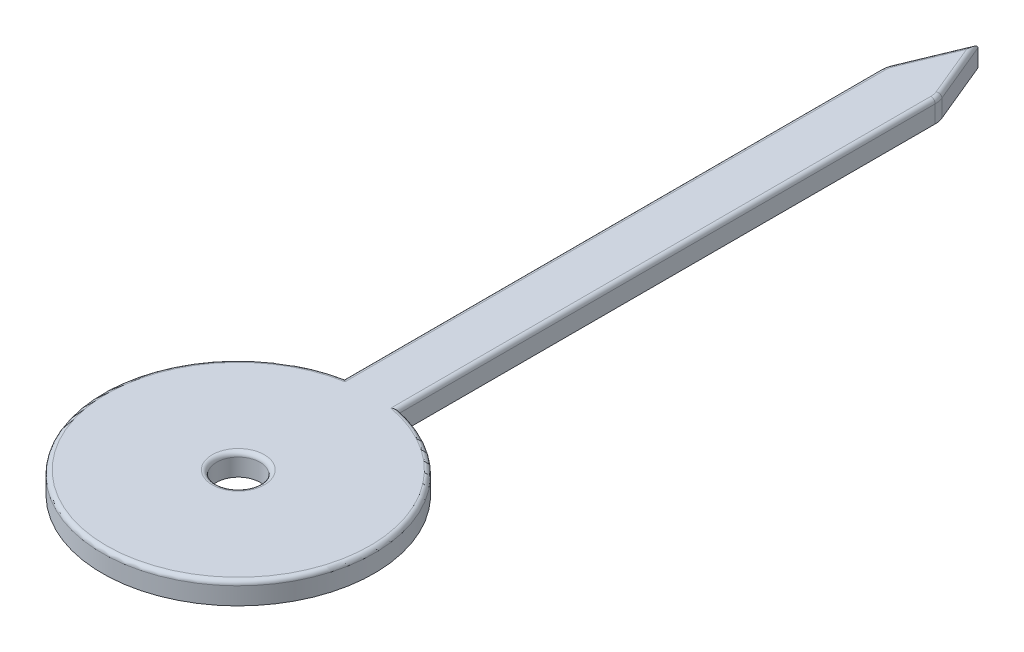
ISO-10303-21;
HEADER;
FILE_DESCRIPTION(('STEP AP214'),'2;1');
FILE_NAME('part.step','',(''),(''),'','','');
FILE_SCHEMA(('AUTOMOTIVE_DESIGN { 1 0 10303 214 1 1 1 1 }'));
ENDSEC;
DATA;
#1=APPLICATION_CONTEXT('core data for automotive mechanical design processes');
#2=APPLICATION_PROTOCOL_DEFINITION('international standard','automotive_design',2000,#1);
#3=PRODUCT_CONTEXT('',#1,'mechanical');
#4=PRODUCT('Part','Part','',(#3));
#5=PRODUCT_RELATED_PRODUCT_CATEGORY('part','',(#4));
#6=PRODUCT_DEFINITION_FORMATION('','',#4);
#7=PRODUCT_DEFINITION_CONTEXT('part definition',#1,'design');
#8=PRODUCT_DEFINITION('design','',#6,#7);
#9=PRODUCT_DEFINITION_SHAPE('','',#8);
#10=(LENGTH_UNIT() NAMED_UNIT(*) SI_UNIT(.MILLI.,.METRE.));
#11=(NAMED_UNIT(*) PLANE_ANGLE_UNIT() SI_UNIT($,.RADIAN.));
#12=(NAMED_UNIT(*) SI_UNIT($,.STERADIAN.) SOLID_ANGLE_UNIT());
#13=UNCERTAINTY_MEASURE_WITH_UNIT(LENGTH_MEASURE(1.E-05),#10,'distance_accuracy_value','');
#14=(GEOMETRIC_REPRESENTATION_CONTEXT(3) GLOBAL_UNCERTAINTY_ASSIGNED_CONTEXT((#13)) GLOBAL_UNIT_ASSIGNED_CONTEXT((#10,
#11,#12)) REPRESENTATION_CONTEXT('',''));
#15=CARTESIAN_POINT('',(0.,0.,0.));
#16=DIRECTION('',(0.,0.,1.));
#17=DIRECTION('',(1.,0.,0.));
#18=AXIS2_PLACEMENT_3D('',#15,#16,#17);
#19=CARTESIAN_POINT('',(0.,0.1,0.));
#20=DIRECTION('',(0.,1.,0.));
#21=DIRECTION('',(0.,0.,1.));
#22=AXIS2_PLACEMENT_3D('',#19,#20,#21);
#23=PLANE('',#22);
#24=CARTESIAN_POINT('',(0.,0.1,0.));
#25=DIRECTION('',(0.,1.,0.));
#26=DIRECTION('',(0.,0.,1.));
#27=AXIS2_PLACEMENT_3D('',#24,#25,#26);
#28=CIRCLE('',#27,0.12);
#29=CARTESIAN_POINT('',(0.,0.1,0.12));
#30=VERTEX_POINT('',#29);
#31=EDGE_CURVE('E188',#30,#30,#28,.F.);
#32=ORIENTED_EDGE('',*,*,#31,.T.);
#33=EDGE_LOOP('',(#32));
#34=FACE_BOUND('',#33,.T.);
#35=CARTESIAN_POINT('',(0.0250000000000001,0.1,-3.0783320679654));
#36=DIRECTION('',(0.,1.,0.));
#37=DIRECTION('',(0.,0.,1.));
#38=AXIS2_PLACEMENT_3D('',#35,#36,#37);
#39=CIRCLE('',#38,0.08);
#40=CARTESIAN_POINT('',(0.105,0.1,-3.0783320679654));
#41=VERTEX_POINT('',#40);
#42=CARTESIAN_POINT('',(0.098910362600903,0.1,-3.1089467425546));
#43=VERTEX_POINT('',#42);
#44=EDGE_CURVE('E183',#41,#43,#39,.T.);
#45=ORIENTED_EDGE('',*,*,#44,.T.);
#46=DIRECTION('',(-0.382683432365091,0.,-0.923879532511286));
#47=VECTOR('',#46,1.);
#48=CARTESIAN_POINT('',(-0.0184775906502258,0.1,-3.3923463313527));
#49=LINE('',#48,#47);
#50=CARTESIAN_POINT('',(0.,0.1,-3.34773748140494));
#51=VERTEX_POINT('',#50);
#52=EDGE_CURVE('E185',#43,#51,#49,.T.);
#53=ORIENTED_EDGE('',*,*,#52,.T.);
#54=DIRECTION('',(-0.382683432365091,0.,0.923879532511286));
#55=VECTOR('',#54,1.);
#56=CARTESIAN_POINT('',(-0.0989103626009029,0.1,-3.10894674255461));
#57=LINE('',#56,#55);
#58=CARTESIAN_POINT('',(-0.0989103626009029,0.1,-3.10894674255461));
#59=VERTEX_POINT('',#58);
#60=EDGE_CURVE('E173',#51,#59,#57,.T.);
#61=ORIENTED_EDGE('',*,*,#60,.T.);
#62=CARTESIAN_POINT('',(-0.0250000000000001,0.1,-3.0783320679654));
#63=DIRECTION('',(0.,1.,0.));
#64=DIRECTION('',(0.,0.,1.));
#65=AXIS2_PLACEMENT_3D('',#62,#63,#64);
#66=CIRCLE('',#65,0.08);
#67=CARTESIAN_POINT('',(-0.105,0.1,-3.0783320679654));
#68=VERTEX_POINT('',#67);
#69=EDGE_CURVE('E175',#59,#68,#66,.T.);
#70=ORIENTED_EDGE('',*,*,#69,.T.);
#71=DIRECTION('',(0.,0.,1.));
#72=VECTOR('',#71,1.);
#73=CARTESIAN_POINT('',(-0.105,0.1,-0.612372435695795));
#74=LINE('',#73,#72);
#75=CARTESIAN_POINT('',(-0.105,0.1,-0.59581876439065));
#76=VERTEX_POINT('',#75);
#77=EDGE_CURVE('E177',#68,#76,#74,.T.);
#78=ORIENTED_EDGE('',*,*,#77,.T.);
#79=CARTESIAN_POINT('',(0.,0.1,0.));
#80=DIRECTION('',(0.,1.,0.));
#81=DIRECTION('',(0.,0.,1.));
#82=AXIS2_PLACEMENT_3D('',#79,#80,#81);
#83=CIRCLE('',#82,0.605000000000001);
#84=CARTESIAN_POINT('',(0.105,0.1,-0.59581876439065));
#85=VERTEX_POINT('',#84);
#86=EDGE_CURVE('E179',#76,#85,#83,.T.);
#87=ORIENTED_EDGE('',*,*,#86,.T.);
#88=DIRECTION('',(0.,0.,-1.));
#89=VECTOR('',#88,1.);
#90=CARTESIAN_POINT('',(0.105,0.1,-3.0783320679654));
#91=LINE('',#90,#89);
#92=EDGE_CURVE('E181',#85,#41,#91,.T.);
#93=ORIENTED_EDGE('',*,*,#92,.T.);
#94=EDGE_LOOP('',(#45,#53,#61,#70,#78,#87,#93));
#95=FACE_BOUND('',#94,.T.);
#96=ADVANCED_FACE('F33',(#34,#95),#23,.T.);
#97=CARTESIAN_POINT('',(0.,0.,0.));
#98=DIRECTION('',(0.,1.,0.));
#99=DIRECTION('',(0.,0.,1.));
#100=AXIS2_PLACEMENT_3D('',#97,#98,#99);
#101=PLANE('',#100);
#102=DIRECTION('',(0.,0.,1.));
#103=VECTOR('',#102,1.);
#104=CARTESIAN_POINT('',(-0.125,0.,-0.612372435695795));
#105=LINE('',#104,#103);
#106=CARTESIAN_POINT('',(-0.125,0.,-3.0783320679654));
#107=VERTEX_POINT('',#106);
#108=CARTESIAN_POINT('',(-0.125,0.,-0.612372435695795));
#109=VERTEX_POINT('',#108);
#110=EDGE_CURVE('E145',#107,#109,#105,.T.);
#111=ORIENTED_EDGE('',*,*,#110,.F.);
#112=CARTESIAN_POINT('',(-0.0250000000000001,0.,-3.0783320679654));
#113=DIRECTION('',(0.,1.,0.));
#114=DIRECTION('',(0.,0.,1.));
#115=AXIS2_PLACEMENT_3D('',#112,#113,#114);
#116=CIRCLE('',#115,0.1);
#117=CARTESIAN_POINT('',(-0.117387953251129,0.,-3.11660041120191));
#118=VERTEX_POINT('',#117);
#119=EDGE_CURVE('E144',#107,#118,#116,.F.);
#120=ORIENTED_EDGE('',*,*,#119,.T.);
#121=DIRECTION('',(-0.382683432365091,0.,0.923879532511286));
#122=VECTOR('',#121,1.);
#123=CARTESIAN_POINT('',(-0.125,0.,-3.09822330470336));
#124=LINE('',#123,#122);
#125=CARTESIAN_POINT('',(0.,0.,-3.4));
#126=VERTEX_POINT('',#125);
#127=EDGE_CURVE('E123',#126,#118,#124,.T.);
#128=ORIENTED_EDGE('',*,*,#127,.F.);
#129=DIRECTION('',(-0.382683432365091,0.,-0.923879532511286));
#130=VECTOR('',#129,1.);
#131=CARTESIAN_POINT('',(0.125,0.,-3.09822330470336));
#132=LINE('',#131,#130);
#133=CARTESIAN_POINT('',(0.117387953251129,0.,-3.11660041120191));
#134=VERTEX_POINT('',#133);
#135=EDGE_CURVE('E132',#134,#126,#132,.T.);
#136=ORIENTED_EDGE('',*,*,#135,.F.);
#137=CARTESIAN_POINT('',(0.0250000000000001,0.,-3.0783320679654));
#138=DIRECTION('',(0.,1.,0.));
#139=DIRECTION('',(0.,0.,1.));
#140=AXIS2_PLACEMENT_3D('',#137,#138,#139);
#141=CIRCLE('',#140,0.1);
#142=CARTESIAN_POINT('',(0.125,0.,-3.0783320679654));
#143=VERTEX_POINT('',#142);
#144=EDGE_CURVE('E161',#134,#143,#141,.F.);
#145=ORIENTED_EDGE('',*,*,#144,.T.);
#146=DIRECTION('',(0.,0.,-1.));
#147=VECTOR('',#146,1.);
#148=CARTESIAN_POINT('',(0.125,0.,-0.612372435695795));
#149=LINE('',#148,#147);
#150=CARTESIAN_POINT('',(0.125,0.,-0.612372435695795));
#151=VERTEX_POINT('',#150);
#152=EDGE_CURVE('E154',#151,#143,#149,.T.);
#153=ORIENTED_EDGE('',*,*,#152,.F.);
#154=CARTESIAN_POINT('',(0.,0.,0.));
#155=DIRECTION('',(0.,1.,0.));
#156=DIRECTION('',(0.,0.,1.));
#157=AXIS2_PLACEMENT_3D('',#154,#155,#156);
#158=CIRCLE('',#157,0.625000000000001);
#159=EDGE_CURVE('E148',#109,#151,#158,.T.);
#160=ORIENTED_EDGE('',*,*,#159,.F.);
#161=EDGE_LOOP('',(#111,#120,#128,#136,#145,#153,#160));
#162=FACE_BOUND('',#161,.T.);
#163=CARTESIAN_POINT('',(0.,0.,0.));
#164=DIRECTION('',(0.,1.,0.));
#165=DIRECTION('',(0.,0.,1.));
#166=AXIS2_PLACEMENT_3D('',#163,#164,#165);
#167=CIRCLE('',#166,0.1);
#168=CARTESIAN_POINT('',(0.,0.,0.1));
#169=VERTEX_POINT('',#168);
#170=EDGE_CURVE('E138',#169,#169,#167,.T.);
#171=ORIENTED_EDGE('',*,*,#170,.T.);
#172=EDGE_LOOP('',(#171));
#173=FACE_BOUND('',#172,.T.);
#174=ADVANCED_FACE('F141',(#162,#173),#101,.F.);
#175=CARTESIAN_POINT('',(0.125,0.1,-3.09822330470336));
#176=DIRECTION('',(-0.923879532511286,0.,0.382683432365091));
#177=DIRECTION('',(0.382683432365091,0.,0.923879532511286));
#178=AXIS2_PLACEMENT_3D('',#175,#176,#177);
#179=PLANE('',#178);
#180=DIRECTION('',(0.,-1.,0.));
#181=VECTOR('',#180,1.);
#182=CARTESIAN_POINT('',(0.,0.1,-3.4));
#183=LINE('',#182,#181);
#184=CARTESIAN_POINT('',(0.,0.08,-3.4));
#185=VERTEX_POINT('',#184);
#186=EDGE_CURVE('E119',#185,#126,#183,.T.);
#187=ORIENTED_EDGE('',*,*,#186,.F.);
#188=DIRECTION('',(-0.382683432365091,0.,-0.923879532511286));
#189=VECTOR('',#188,1.);
#190=CARTESIAN_POINT('',(0.117387953251129,0.08,-3.11660041120191));
#191=LINE('',#190,#189);
#192=CARTESIAN_POINT('',(0.117387953251129,0.08,-3.11660041120191));
#193=VERTEX_POINT('',#192);
#194=EDGE_CURVE('E191',#185,#193,#191,.F.);
#195=ORIENTED_EDGE('',*,*,#194,.T.);
#196=DIRECTION('',(0.,-1.,0.));
#197=VECTOR('',#196,1.);
#198=CARTESIAN_POINT('',(0.117387953251129,0.1,-3.11660041120191));
#199=LINE('',#198,#197);
#200=EDGE_CURVE('E135',#193,#134,#199,.T.);
#201=ORIENTED_EDGE('',*,*,#200,.T.);
#202=ORIENTED_EDGE('',*,*,#135,.T.);
#203=EDGE_LOOP('',(#187,#195,#201,#202));
#204=FACE_BOUND('',#203,.T.);
#205=ADVANCED_FACE('F133',(#204),#179,.F.);
#206=CARTESIAN_POINT('',(-0.125,0.1,-3.09822330470336));
#207=DIRECTION('',(0.923879532511286,0.,0.382683432365091));
#208=DIRECTION('',(0.382683432365091,0.,-0.923879532511286));
#209=AXIS2_PLACEMENT_3D('',#206,#207,#208);
#210=PLANE('',#209);
#211=DIRECTION('',(0.,-1.,0.));
#212=VECTOR('',#211,1.);
#213=CARTESIAN_POINT('',(-0.117387953251129,0.1,-3.11660041120191));
#214=LINE('',#213,#212);
#215=CARTESIAN_POINT('',(-0.117387953251129,0.08,-3.11660041120191));
#216=VERTEX_POINT('',#215);
#217=EDGE_CURVE('E164',#118,#216,#214,.F.);
#218=ORIENTED_EDGE('',*,*,#217,.T.);
#219=DIRECTION('',(-0.382683432365091,0.,0.923879532511286));
#220=VECTOR('',#219,1.);
#221=CARTESIAN_POINT('',(0.,0.08,-3.4));
#222=LINE('',#221,#220);
#223=EDGE_CURVE('E11',#216,#185,#222,.F.);
#224=ORIENTED_EDGE('',*,*,#223,.T.);
#225=ORIENTED_EDGE('',*,*,#186,.T.);
#226=ORIENTED_EDGE('',*,*,#127,.T.);
#227=EDGE_LOOP('',(#218,#224,#225,#226));
#228=FACE_BOUND('',#227,.T.);
#229=ADVANCED_FACE('F121',(#228),#210,.F.);
#230=CARTESIAN_POINT('',(-0.125,0.1,-0.612372435695795));
#231=DIRECTION('',(1.,0.,0.));
#232=DIRECTION('',(0.,0.,-1.));
#233=AXIS2_PLACEMENT_3D('',#230,#231,#232);
#234=PLANE('',#233);
#235=DIRECTION('',(0.,-1.,0.));
#236=VECTOR('',#235,1.);
#237=CARTESIAN_POINT('',(-0.125,0.1,-0.612372435695795));
#238=LINE('',#237,#236);
#239=CARTESIAN_POINT('',(-0.125,0.08,-0.612372435695795));
#240=VERTEX_POINT('',#239);
#241=EDGE_CURVE('E129',#240,#109,#238,.T.);
#242=ORIENTED_EDGE('',*,*,#241,.F.);
#243=DIRECTION('',(0.,0.,1.));
#244=VECTOR('',#243,1.);
#245=CARTESIAN_POINT('',(-0.125,0.08,-3.0783320679654));
#246=LINE('',#245,#244);
#247=CARTESIAN_POINT('',(-0.125,0.08,-3.0783320679654));
#248=VERTEX_POINT('',#247);
#249=EDGE_CURVE('E61',#240,#248,#246,.F.);
#250=ORIENTED_EDGE('',*,*,#249,.T.);
#251=DIRECTION('',(0.,-1.,0.));
#252=VECTOR('',#251,1.);
#253=CARTESIAN_POINT('',(-0.125,0.1,-3.0783320679654));
#254=LINE('',#253,#252);
#255=EDGE_CURVE('E128',#248,#107,#254,.T.);
#256=ORIENTED_EDGE('',*,*,#255,.T.);
#257=ORIENTED_EDGE('',*,*,#110,.T.);
#258=EDGE_LOOP('',(#242,#250,#256,#257));
#259=FACE_BOUND('',#258,.T.);
#260=ADVANCED_FACE('F255',(#259),#234,.F.);
#261=CARTESIAN_POINT('',(0.,0.1,0.));
#262=DIRECTION('',(0.,-1.,0.));
#263=DIRECTION('',(0.,0.,-1.));
#264=AXIS2_PLACEMENT_3D('',#261,#262,#263);
#265=CYLINDRICAL_SURFACE('',#264,0.625000000000001);
#266=DIRECTION('',(0.,-1.,0.));
#267=VECTOR('',#266,1.);
#268=CARTESIAN_POINT('',(0.125,0.1,-0.612372435695795));
#269=LINE('',#268,#267);
#270=CARTESIAN_POINT('',(0.125,0.08,-0.612372435695795));
#271=VERTEX_POINT('',#270);
#272=EDGE_CURVE('E157',#271,#151,#269,.T.);
#273=ORIENTED_EDGE('',*,*,#272,.F.);
#274=CARTESIAN_POINT('',(0.,0.08,0.));
#275=DIRECTION('',(0.,1.,0.));
#276=DIRECTION('',(0.,0.,1.));
#277=AXIS2_PLACEMENT_3D('',#274,#275,#276);
#278=CIRCLE('',#277,0.625000000000001);
#279=EDGE_CURVE('E197',#271,#240,#278,.F.);
#280=ORIENTED_EDGE('',*,*,#279,.T.);
#281=ORIENTED_EDGE('',*,*,#241,.T.);
#282=ORIENTED_EDGE('',*,*,#159,.T.);
#283=EDGE_LOOP('',(#273,#280,#281,#282));
#284=FACE_BOUND('',#283,.T.);
#285=ADVANCED_FACE('F251',(#284),#265,.T.);
#286=CARTESIAN_POINT('',(0.125,0.1,-0.612372435695795));
#287=DIRECTION('',(-1.,0.,0.));
#288=DIRECTION('',(0.,0.,1.));
#289=AXIS2_PLACEMENT_3D('',#286,#287,#288);
#290=PLANE('',#289);
#291=DIRECTION('',(0.,-1.,0.));
#292=VECTOR('',#291,1.);
#293=CARTESIAN_POINT('',(0.125,0.1,-3.0783320679654));
#294=LINE('',#293,#292);
#295=CARTESIAN_POINT('',(0.125,0.08,-3.0783320679654));
#296=VERTEX_POINT('',#295);
#297=EDGE_CURVE('E167',#143,#296,#294,.F.);
#298=ORIENTED_EDGE('',*,*,#297,.T.);
#299=DIRECTION('',(0.,0.,-1.));
#300=VECTOR('',#299,1.);
#301=CARTESIAN_POINT('',(0.125,0.08,-0.612372435695795));
#302=LINE('',#301,#300);
#303=EDGE_CURVE('E195',#296,#271,#302,.F.);
#304=ORIENTED_EDGE('',*,*,#303,.T.);
#305=ORIENTED_EDGE('',*,*,#272,.T.);
#306=ORIENTED_EDGE('',*,*,#152,.T.);
#307=EDGE_LOOP('',(#298,#304,#305,#306));
#308=FACE_BOUND('',#307,.T.);
#309=ADVANCED_FACE('F248',(#308),#290,.F.);
#310=CARTESIAN_POINT('',(0.,0.1,0.));
#311=DIRECTION('',(0.,-1.,0.));
#312=DIRECTION('',(0.,0.,-1.));
#313=AXIS2_PLACEMENT_3D('',#310,#311,#312);
#314=CYLINDRICAL_SURFACE('',#313,0.1);
#315=CARTESIAN_POINT('',(0.,0.08,0.));
#316=DIRECTION('',(0.,1.,0.));
#317=DIRECTION('',(0.,0.,1.));
#318=AXIS2_PLACEMENT_3D('',#315,#316,#317);
#319=CIRCLE('',#318,0.1);
#320=CARTESIAN_POINT('',(0.,0.08,0.1));
#321=VERTEX_POINT('',#320);
#322=EDGE_CURVE('E170',#321,#321,#319,.T.);
#323=ORIENTED_EDGE('',*,*,#322,.T.);
#324=EDGE_LOOP('',(#323));
#325=FACE_BOUND('',#324,.T.);
#326=ORIENTED_EDGE('',*,*,#170,.F.);
#327=EDGE_LOOP('',(#326));
#328=FACE_BOUND('',#327,.T.);
#329=ADVANCED_FACE('F246',(#325,#328),#314,.F.);
#330=CARTESIAN_POINT('',(-0.0250000000000001,0.1,-3.0783320679654));
#331=DIRECTION('',(0.,-1.,0.));
#332=DIRECTION('',(0.,0.,-1.));
#333=AXIS2_PLACEMENT_3D('',#330,#331,#332);
#334=CYLINDRICAL_SURFACE('',#333,0.1);
#335=ORIENTED_EDGE('',*,*,#255,.F.);
#336=CARTESIAN_POINT('',(-0.0250000000000001,0.08,-3.0783320679654));
#337=DIRECTION('',(0.,1.,0.));
#338=DIRECTION('',(0.,0.,1.));
#339=AXIS2_PLACEMENT_3D('',#336,#337,#338);
#340=CIRCLE('',#339,0.1);
#341=EDGE_CURVE('E46',#248,#216,#340,.F.);
#342=ORIENTED_EDGE('',*,*,#341,.T.);
#343=ORIENTED_EDGE('',*,*,#217,.F.);
#344=ORIENTED_EDGE('',*,*,#119,.F.);
#345=EDGE_LOOP('',(#335,#342,#343,#344));
#346=FACE_BOUND('',#345,.T.);
#347=ADVANCED_FACE('F263',(#346),#334,.T.);
#348=CARTESIAN_POINT('',(0.0250000000000001,0.1,-3.0783320679654));
#349=DIRECTION('',(0.,-1.,0.));
#350=DIRECTION('',(0.,0.,-1.));
#351=AXIS2_PLACEMENT_3D('',#348,#349,#350);
#352=CYLINDRICAL_SURFACE('',#351,0.1);
#353=ORIENTED_EDGE('',*,*,#200,.F.);
#354=CARTESIAN_POINT('',(0.0250000000000001,0.08,-3.0783320679654));
#355=DIRECTION('',(0.,1.,0.));
#356=DIRECTION('',(0.,0.,1.));
#357=AXIS2_PLACEMENT_3D('',#354,#355,#356);
#358=CIRCLE('',#357,0.1);
#359=EDGE_CURVE('E193',#193,#296,#358,.F.);
#360=ORIENTED_EDGE('',*,*,#359,.T.);
#361=ORIENTED_EDGE('',*,*,#297,.F.);
#362=ORIENTED_EDGE('',*,*,#144,.F.);
#363=EDGE_LOOP('',(#353,#360,#361,#362));
#364=FACE_BOUND('',#363,.T.);
#365=ADVANCED_FACE('F233',(#364),#352,.T.);
#366=CARTESIAN_POINT('',(0.,0.08,0.));
#367=DIRECTION('',(0.,1.,0.));
#368=DIRECTION('',(0.,0.,1.));
#369=AXIS2_PLACEMENT_3D('',#366,#367,#368);
#370=TOROIDAL_SURFACE('',#369,0.12,0.02);
#371=ORIENTED_EDGE('',*,*,#31,.F.);
#372=EDGE_LOOP('',(#371));
#373=FACE_BOUND('',#372,.T.);
#374=ORIENTED_EDGE('',*,*,#322,.F.);
#375=EDGE_LOOP('',(#374));
#376=FACE_BOUND('',#375,.T.);
#377=ADVANCED_FACE('F225',(#373,#376),#370,.T.);
#378=CARTESIAN_POINT('',(0.,0.08,0.));
#379=DIRECTION('',(0.,1.,0.));
#380=DIRECTION('',(0.,0.,1.));
#381=AXIS2_PLACEMENT_3D('',#378,#379,#380);
#382=TOROIDAL_SURFACE('',#381,0.605000000000001,0.02);
#383=CARTESIAN_POINT('',(0.125,0.08,-0.612372435695795));
#384=CARTESIAN_POINT('',(0.125001455655169,0.0809467000931492,-0.612373598014908));
#385=CARTESIAN_POINT('',(0.124932885057518,0.0818916553678453,-0.612317637011507));
#386=CARTESIAN_POINT('',(0.124667994976258,0.0837448826422002,-0.612101310916542));
#387=CARTESIAN_POINT('',(0.124472543412886,0.0846533596622723,-0.61194165513808));
#388=CARTESIAN_POINT('',(0.123966364836768,0.0864123674252115,-0.611527926225375));
#389=CARTESIAN_POINT('',(0.123655849274312,0.0872630010928063,-0.611274026279886));
#390=CARTESIAN_POINT('',(0.122936498310423,0.0888924964842966,-0.610685340961826));
#391=CARTESIAN_POINT('',(0.122527497483347,0.0896712343674777,-0.61035041949301));
#392=CARTESIAN_POINT('',(0.121487234894111,0.0913780334616979,-0.60949771749979));
#393=CARTESIAN_POINT('',(0.120826531379903,0.0922759837250603,-0.608955558891838));
#394=CARTESIAN_POINT('',(0.119401696801963,0.0939204708766721,-0.607784535117781));
#395=CARTESIAN_POINT('',(0.118637396099713,0.0946667542959807,-0.607155527706152));
#396=CARTESIAN_POINT('',(0.116811565377428,0.0961947887354066,-0.605650291676102));
#397=CARTESIAN_POINT('',(0.115726526977082,0.0969285663195184,-0.604753990434422));
#398=CARTESIAN_POINT('',(0.113482014366379,0.0981574984545024,-0.602895413446569));
#399=CARTESIAN_POINT('',(0.112322504544239,0.0986525378648902,-0.60193310612151));
#400=CARTESIAN_POINT('',(0.110249101773615,0.09932172745047,-0.600208011870175));
#401=CARTESIAN_POINT('',(0.109343660103895,0.0995445374744497,-0.599453284943593));
#402=CARTESIAN_POINT('',(0.107522326082753,0.0998617848292955,-0.597932188652762));
#403=CARTESIAN_POINT('',(0.106606454021343,0.09995643887337,-0.597165841164272));
#404=CARTESIAN_POINT('',(0.105460331605267,0.0999960269322304,-0.596204972785494));
#405=CARTESIAN_POINT('',(0.105230119987562,0.0999999974999685,-0.596011877581894));
#406=CARTESIAN_POINT('',(0.105,0.1,-0.59581876439065));
#407=B_SPLINE_CURVE_WITH_KNOTS('',3,(#383,#384,#385,#386,#387,#388,#389,#390,#391,#392,#393,
#394,#395,#396,#397,#398,#399,#400,#401,#402,#403,#404,#405,#406),.UNSPECIFIED.,.F.,.F.,(4,2,2,
2,2,2,2,2,2,2,2,4),(0.,0.0028332081188868,0.00564723723549609,0.00845612052002951,
0.0112697552060633,0.0149686743038561,0.0186737251824725,0.0234103183311797,0.0281491936016218,
0.0317414859026683,0.0353276959780369,0.0362290670526058),.UNSPECIFIED.);
#408=EDGE_CURVE('E213',#85,#271,#407,.F.);
#409=ORIENTED_EDGE('',*,*,#408,.F.);
#410=ORIENTED_EDGE('',*,*,#86,.F.);
#411=CARTESIAN_POINT('',(-0.125,0.08,-0.612372435695795));
#412=CARTESIAN_POINT('',(-0.125001455655169,0.0809467000931493,-0.612373598014908));
#413=CARTESIAN_POINT('',(-0.124932885057518,0.0818916553678453,-0.612317637011507));
#414=CARTESIAN_POINT('',(-0.124667994976258,0.0837448826422001,-0.612101310916542));
#415=CARTESIAN_POINT('',(-0.124472543412886,0.0846533596622723,-0.61194165513808));
#416=CARTESIAN_POINT('',(-0.123966364836768,0.0864123674252115,-0.611527926225375));
#417=CARTESIAN_POINT('',(-0.123655849274312,0.0872630010928063,-0.611274026279885));
#418=CARTESIAN_POINT('',(-0.122936498310423,0.0888924964842966,-0.610685340961826));
#419=CARTESIAN_POINT('',(-0.122527497483347,0.0896712343674778,-0.61035041949301));
#420=CARTESIAN_POINT('',(-0.121487234894111,0.091378033461698,-0.60949771749979));
#421=CARTESIAN_POINT('',(-0.120826531379903,0.0922759837250604,-0.608955558891838));
#422=CARTESIAN_POINT('',(-0.119401696801962,0.0939204708766721,-0.60778453511778));
#423=CARTESIAN_POINT('',(-0.118637396099713,0.0946667542959808,-0.607155527706152));
#424=CARTESIAN_POINT('',(-0.116811565377428,0.0961947887354067,-0.605650291676102));
#425=CARTESIAN_POINT('',(-0.115726526977081,0.0969285663195185,-0.604753990434422));
#426=CARTESIAN_POINT('',(-0.113482014366379,0.0981574984545025,-0.602895413446569));
#427=CARTESIAN_POINT('',(-0.112322504544239,0.0986525378648903,-0.60193310612151));
#428=CARTESIAN_POINT('',(-0.110249101773615,0.0993217274504699,-0.600208011870175));
#429=CARTESIAN_POINT('',(-0.109343660103895,0.0995445374744497,-0.599453284943593));
#430=CARTESIAN_POINT('',(-0.107522326082753,0.0998617848292955,-0.597932188652762));
#431=CARTESIAN_POINT('',(-0.106606454021343,0.0999564388733701,-0.597165841164272));
#432=CARTESIAN_POINT('',(-0.105460331605267,0.0999960269322304,-0.596204972785494));
#433=CARTESIAN_POINT('',(-0.105230119987562,0.0999999974999685,-0.596011877581894));
#434=CARTESIAN_POINT('',(-0.105,0.1,-0.59581876439065));
#435=B_SPLINE_CURVE_WITH_KNOTS('',3,(#411,#412,#413,#414,#415,#416,#417,#418,#419,#420,#421,
#422,#423,#424,#425,#426,#427,#428,#429,#430,#431,#432,#433,#434),.UNSPECIFIED.,.F.,.F.,(4,2,2,
2,2,2,2,2,2,2,2,4),(0.,0.00283320811888679,0.00564723723549613,0.00845612052002952,
0.0112697552060633,0.0149686743038563,0.0186737251824726,0.0234103183311798,0.0281491936016219,
0.0317414859026682,0.0353276959780369,0.0362290670526058),.UNSPECIFIED.);
#436=EDGE_CURVE('E38',#240,#76,#435,.T.);
#437=ORIENTED_EDGE('',*,*,#436,.F.);
#438=ORIENTED_EDGE('',*,*,#279,.F.);
#439=EDGE_LOOP('',(#409,#410,#437,#438));
#440=FACE_BOUND('',#439,.T.);
#441=ADVANCED_FACE('F222',(#440),#382,.T.);
#442=CARTESIAN_POINT('',(-0.105,0.08,0.));
#443=DIRECTION('',(0.,0.,-1.));
#444=DIRECTION('',(-1.,0.,0.));
#445=AXIS2_PLACEMENT_3D('',#442,#443,#444);
#446=CYLINDRICAL_SURFACE('',#445,0.02);
#447=ORIENTED_EDGE('',*,*,#436,.T.);
#448=ORIENTED_EDGE('',*,*,#77,.F.);
#449=CARTESIAN_POINT('',(-0.105,0.08,-3.0783320679654));
#450=DIRECTION('',(0.,0.,-1.));
#451=DIRECTION('',(-1.,0.,0.));
#452=AXIS2_PLACEMENT_3D('',#449,#450,#451);
#453=CIRCLE('',#452,0.02);
#454=EDGE_CURVE('E211',#248,#68,#453,.T.);
#455=ORIENTED_EDGE('',*,*,#454,.F.);
#456=ORIENTED_EDGE('',*,*,#249,.F.);
#457=EDGE_LOOP('',(#447,#448,#455,#456));
#458=FACE_BOUND('',#457,.T.);
#459=ADVANCED_FACE('F35',(#458),#446,.T.);
#460=CARTESIAN_POINT('',(0.105,0.08,0.));
#461=DIRECTION('',(0.,0.,1.));
#462=DIRECTION('',(1.,0.,0.));
#463=AXIS2_PLACEMENT_3D('',#460,#461,#462);
#464=CYLINDRICAL_SURFACE('',#463,0.02);
#465=ORIENTED_EDGE('',*,*,#408,.T.);
#466=ORIENTED_EDGE('',*,*,#303,.F.);
#467=CARTESIAN_POINT('',(0.105,0.08,-3.0783320679654));
#468=DIRECTION('',(0.,0.,-1.));
#469=DIRECTION('',(-1.,0.,0.));
#470=AXIS2_PLACEMENT_3D('',#467,#468,#469);
#471=CIRCLE('',#470,0.02);
#472=EDGE_CURVE('E208',#41,#296,#471,.T.);
#473=ORIENTED_EDGE('',*,*,#472,.F.);
#474=ORIENTED_EDGE('',*,*,#92,.F.);
#475=EDGE_LOOP('',(#465,#466,#473,#474));
#476=FACE_BOUND('',#475,.T.);
#477=ADVANCED_FACE('F219',(#476),#464,.T.);
#478=CARTESIAN_POINT('',(-0.0250000000000001,0.08,-3.0783320679654));
#479=DIRECTION('',(0.,1.,0.));
#480=DIRECTION('',(0.,0.,1.));
#481=AXIS2_PLACEMENT_3D('',#478,#479,#480);
#482=TOROIDAL_SURFACE('',#481,0.08,0.02);
#483=ORIENTED_EDGE('',*,*,#454,.T.);
#484=ORIENTED_EDGE('',*,*,#69,.F.);
#485=CARTESIAN_POINT('',(-0.0989103626009031,0.08,-3.10894674255461));
#486=DIRECTION('',(0.382683432365092,0.,-0.923879532511286));
#487=DIRECTION('',(-0.923879532511286,0.,-0.382683432365092));
#488=AXIS2_PLACEMENT_3D('',#485,#486,#487);
#489=CIRCLE('',#488,0.02);
#490=EDGE_CURVE('E205',#216,#59,#489,.T.);
#491=ORIENTED_EDGE('',*,*,#490,.F.);
#492=ORIENTED_EDGE('',*,*,#341,.F.);
#493=EDGE_LOOP('',(#483,#484,#491,#492));
#494=FACE_BOUND('',#493,.T.);
#495=ADVANCED_FACE('F279',(#494),#482,.T.);
#496=CARTESIAN_POINT('',(0.0250000000000001,0.08,-3.0783320679654));
#497=DIRECTION('',(0.,1.,0.));
#498=DIRECTION('',(0.,0.,1.));
#499=AXIS2_PLACEMENT_3D('',#496,#497,#498);
#500=TOROIDAL_SURFACE('',#499,0.08,0.02);
#501=ORIENTED_EDGE('',*,*,#472,.T.);
#502=ORIENTED_EDGE('',*,*,#359,.F.);
#503=CARTESIAN_POINT('',(0.098910362600903,0.08,-3.1089467425546));
#504=DIRECTION('',(-0.382683432365092,0.,-0.923879532511286));
#505=DIRECTION('',(-0.923879532511286,0.,0.382683432365092));
#506=AXIS2_PLACEMENT_3D('',#503,#504,#505);
#507=CIRCLE('',#506,0.02);
#508=EDGE_CURVE('E203',#43,#193,#507,.T.);
#509=ORIENTED_EDGE('',*,*,#508,.F.);
#510=ORIENTED_EDGE('',*,*,#44,.F.);
#511=EDGE_LOOP('',(#501,#502,#509,#510));
#512=FACE_BOUND('',#511,.T.);
#513=ADVANCED_FACE('F276',(#512),#500,.T.);
#514=CARTESIAN_POINT('',(-1.18360393736691,0.08,-0.49026480333557));
#515=DIRECTION('',(0.382683432365091,0.,-0.923879532511286));
#516=DIRECTION('',(-0.923879532511286,0.,-0.382683432365091));
#517=AXIS2_PLACEMENT_3D('',#514,#515,#516);
#518=CYLINDRICAL_SURFACE('',#517,0.02);
#519=ORIENTED_EDGE('',*,*,#490,.T.);
#520=ORIENTED_EDGE('',*,*,#60,.F.);
#521=CARTESIAN_POINT('',(0.,0.08,-3.34773748140495));
#522=DIRECTION('',(1.,0.,0.));
#523=DIRECTION('',(0.,0.,-1.));
#524=AXIS2_PLACEMENT_3D('',#521,#522,#523);
#525=ELLIPSE('',#524,0.0522625185950549,0.02);
#526=EDGE_CURVE('E201',#185,#51,#525,.T.);
#527=ORIENTED_EDGE('',*,*,#526,.F.);
#528=ORIENTED_EDGE('',*,*,#223,.F.);
#529=EDGE_LOOP('',(#519,#520,#527,#528));
#530=FACE_BOUND('',#529,.T.);
#531=ADVANCED_FACE('F272',(#530),#518,.T.);
#532=CARTESIAN_POINT('',(1.18360393736691,0.08,-0.49026480333557));
#533=DIRECTION('',(0.382683432365091,0.,0.923879532511286));
#534=DIRECTION('',(0.923879532511286,0.,-0.382683432365091));
#535=AXIS2_PLACEMENT_3D('',#532,#533,#534);
#536=CYLINDRICAL_SURFACE('',#535,0.02);
#537=ORIENTED_EDGE('',*,*,#508,.T.);
#538=ORIENTED_EDGE('',*,*,#194,.F.);
#539=ORIENTED_EDGE('',*,*,#526,.T.);
#540=ORIENTED_EDGE('',*,*,#52,.F.);
#541=EDGE_LOOP('',(#537,#538,#539,#540));
#542=FACE_BOUND('',#541,.T.);
#543=ADVANCED_FACE('F269',(#542),#536,.T.);
#544=CLOSED_SHELL('',(#96,#174,#205,#229,#260,#285,#309,#329,#347,#365,#377,#441,#459,#477,#495,
#513,#531,#543));
#545=MANIFOLD_SOLID_BREP('B2',#544);
#546=ADVANCED_BREP_SHAPE_REPRESENTATION('',(#18,#545),#14);
#547=SHAPE_DEFINITION_REPRESENTATION(#9,#546);
ENDSEC;
END-ISO-10303-21;
